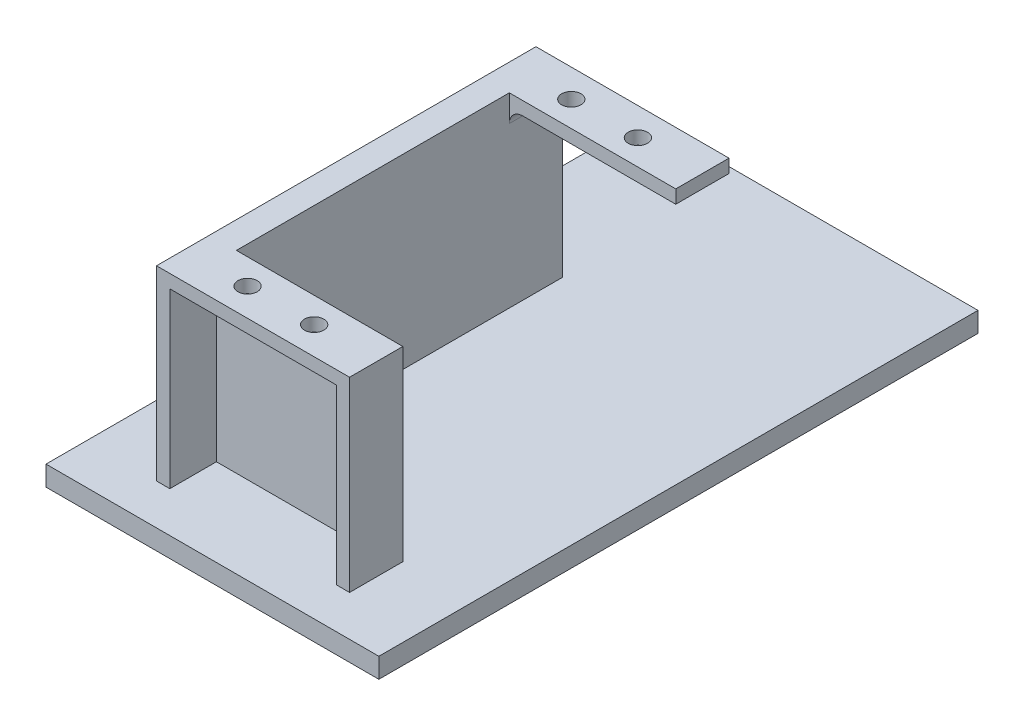
ISO-10303-21;
HEADER;
FILE_DESCRIPTION(('STEP AP214'),'2;1');
FILE_NAME('part.step','',(''),(''),'','','');
FILE_SCHEMA(('AUTOMOTIVE_DESIGN { 1 0 10303 214 1 1 1 1 }'));
ENDSEC;
DATA;
#1=APPLICATION_CONTEXT('core data for automotive mechanical design processes');
#2=APPLICATION_PROTOCOL_DEFINITION('international standard','automotive_design',2000,#1);
#3=PRODUCT_CONTEXT('',#1,'mechanical');
#4=PRODUCT('Part','Part','',(#3));
#5=PRODUCT_RELATED_PRODUCT_CATEGORY('part','',(#4));
#6=PRODUCT_DEFINITION_FORMATION('','',#4);
#7=PRODUCT_DEFINITION_CONTEXT('part definition',#1,'design');
#8=PRODUCT_DEFINITION('design','',#6,#7);
#9=PRODUCT_DEFINITION_SHAPE('','',#8);
#10=(LENGTH_UNIT() NAMED_UNIT(*) SI_UNIT(.MILLI.,.METRE.));
#11=(NAMED_UNIT(*) PLANE_ANGLE_UNIT() SI_UNIT($,.RADIAN.));
#12=(NAMED_UNIT(*) SI_UNIT($,.STERADIAN.) SOLID_ANGLE_UNIT());
#13=UNCERTAINTY_MEASURE_WITH_UNIT(LENGTH_MEASURE(1.E-05),#10,'distance_accuracy_value','');
#14=(GEOMETRIC_REPRESENTATION_CONTEXT(3) GLOBAL_UNCERTAINTY_ASSIGNED_CONTEXT((#13)) GLOBAL_UNIT_ASSIGNED_CONTEXT((#10,
#11,#12)) REPRESENTATION_CONTEXT('',''));
#15=CARTESIAN_POINT('',(0.,0.,0.));
#16=DIRECTION('',(0.,0.,1.));
#17=DIRECTION('',(1.,0.,0.));
#18=AXIS2_PLACEMENT_3D('',#15,#16,#17);
#19=CARTESIAN_POINT('',(14.5,28.,-28.5));
#20=DIRECTION('',(-1.,0.,0.));
#21=DIRECTION('',(0.,0.,1.));
#22=AXIS2_PLACEMENT_3D('',#19,#20,#21);
#23=PLANE('',#22);
#24=DIRECTION('',(0.,0.,-1.));
#25=VECTOR('',#24,1.);
#26=CARTESIAN_POINT('',(14.5,28.,-28.5));
#27=LINE('',#26,#25);
#28=CARTESIAN_POINT('',(14.5,28.,-20.5));
#29=VERTEX_POINT('',#28);
#30=CARTESIAN_POINT('',(14.5,28.,-28.5));
#31=VERTEX_POINT('',#30);
#32=EDGE_CURVE('E272',#29,#31,#27,.T.);
#33=ORIENTED_EDGE('',*,*,#32,.F.);
#34=DIRECTION('',(0.,1.,0.));
#35=VECTOR('',#34,1.);
#36=CARTESIAN_POINT('',(14.5,3.,-20.5));
#37=LINE('',#36,#35);
#38=CARTESIAN_POINT('',(14.5,26.,-20.5));
#39=VERTEX_POINT('',#38);
#40=EDGE_CURVE('E181',#39,#29,#37,.T.);
#41=ORIENTED_EDGE('',*,*,#40,.F.);
#42=DIRECTION('',(0.,0.,1.));
#43=VECTOR('',#42,1.);
#44=CARTESIAN_POINT('',(14.5,26.,-28.5));
#45=LINE('',#44,#43);
#46=CARTESIAN_POINT('',(14.5,26.,-28.5));
#47=VERTEX_POINT('',#46);
#48=EDGE_CURVE('E184',#47,#39,#45,.T.);
#49=ORIENTED_EDGE('',*,*,#48,.F.);
#50=DIRECTION('',(0.,-1.,0.));
#51=VECTOR('',#50,1.);
#52=CARTESIAN_POINT('',(14.5,28.,-28.5));
#53=LINE('',#52,#51);
#54=EDGE_CURVE('E297',#31,#47,#53,.T.);
#55=ORIENTED_EDGE('',*,*,#54,.F.);
#56=EDGE_LOOP('',(#33,#41,#49,#55));
#57=FACE_BOUND('',#56,.T.);
#58=ADVANCED_FACE('F33',(#57),#23,.F.);
#59=CARTESIAN_POINT('',(-14.5,28.,28.5));
#60=DIRECTION('',(0.,0.,-1.));
#61=DIRECTION('',(-1.,0.,0.));
#62=AXIS2_PLACEMENT_3D('',#59,#60,#61);
#63=PLANE('',#62);
#64=DIRECTION('',(0.,-1.,0.));
#65=VECTOR('',#64,1.);
#66=CARTESIAN_POINT('',(12.5,26.,28.5));
#67=LINE('',#66,#65);
#68=CARTESIAN_POINT('',(12.5,26.,28.5));
#69=VERTEX_POINT('',#68);
#70=CARTESIAN_POINT('',(12.5,0.,28.5));
#71=VERTEX_POINT('',#70);
#72=EDGE_CURVE('E205',#69,#71,#67,.T.);
#73=ORIENTED_EDGE('',*,*,#72,.T.);
#74=DIRECTION('',(1.,0.,0.));
#75=VECTOR('',#74,1.);
#76=CARTESIAN_POINT('',(-14.5,0.,28.5));
#77=LINE('',#76,#75);
#78=CARTESIAN_POINT('',(14.5,0.,28.5));
#79=VERTEX_POINT('',#78);
#80=EDGE_CURVE('E285',#71,#79,#77,.T.);
#81=ORIENTED_EDGE('',*,*,#80,.T.);
#82=DIRECTION('',(0.,-1.,0.));
#83=VECTOR('',#82,1.);
#84=CARTESIAN_POINT('',(14.5,28.,28.5));
#85=LINE('',#84,#83);
#86=CARTESIAN_POINT('',(14.5,28.,28.5));
#87=VERTEX_POINT('',#86);
#88=EDGE_CURVE('E278',#87,#79,#85,.T.);
#89=ORIENTED_EDGE('',*,*,#88,.F.);
#90=DIRECTION('',(1.,0.,0.));
#91=VECTOR('',#90,1.);
#92=CARTESIAN_POINT('',(-14.5,28.,28.5));
#93=LINE('',#92,#91);
#94=CARTESIAN_POINT('',(-14.5,28.,28.5));
#95=VERTEX_POINT('',#94);
#96=EDGE_CURVE('E276',#95,#87,#93,.T.);
#97=ORIENTED_EDGE('',*,*,#96,.F.);
#98=DIRECTION('',(0.,-1.,0.));
#99=VECTOR('',#98,1.);
#100=CARTESIAN_POINT('',(-14.5,28.,28.5));
#101=LINE('',#100,#99);
#102=CARTESIAN_POINT('',(-14.5,0.,28.5));
#103=VERTEX_POINT('',#102);
#104=EDGE_CURVE('E291',#95,#103,#101,.T.);
#105=ORIENTED_EDGE('',*,*,#104,.T.);
#106=CARTESIAN_POINT('',(-12.5,0.,28.5));
#107=VERTEX_POINT('',#106);
#108=EDGE_CURVE('E286',#103,#107,#77,.T.);
#109=ORIENTED_EDGE('',*,*,#108,.T.);
#110=DIRECTION('',(0.,1.,0.));
#111=VECTOR('',#110,1.);
#112=CARTESIAN_POINT('',(-12.5,26.,28.5));
#113=LINE('',#112,#111);
#114=CARTESIAN_POINT('',(-12.5,26.,28.5));
#115=VERTEX_POINT('',#114);
#116=EDGE_CURVE('E220',#107,#115,#113,.T.);
#117=ORIENTED_EDGE('',*,*,#116,.T.);
#118=DIRECTION('',(1.,0.,0.));
#119=VECTOR('',#118,1.);
#120=CARTESIAN_POINT('',(12.5,26.,28.5));
#121=LINE('',#120,#119);
#122=EDGE_CURVE('E210',#115,#69,#121,.T.);
#123=ORIENTED_EDGE('',*,*,#122,.T.);
#124=EDGE_LOOP('',(#73,#81,#89,#97,#105,#109,#117,#123));
#125=FACE_BOUND('',#124,.T.);
#126=ADVANCED_FACE('F350',(#125),#63,.F.);
#127=CARTESIAN_POINT('',(-5.,28.,24.32));
#128=DIRECTION('',(0.,-1.,0.));
#129=DIRECTION('',(0.,0.,-1.));
#130=AXIS2_PLACEMENT_3D('',#127,#128,#129);
#131=CYLINDRICAL_SURFACE('',#130,1.45);
#132=CARTESIAN_POINT('',(-5.,28.,24.32));
#133=DIRECTION('',(0.,1.,0.));
#134=DIRECTION('',(0.,0.,1.));
#135=AXIS2_PLACEMENT_3D('',#132,#133,#134);
#136=CIRCLE('',#135,1.45);
#137=CARTESIAN_POINT('',(-5.,28.,25.77));
#138=VERTEX_POINT('',#137);
#139=EDGE_CURVE('E244',#138,#138,#136,.T.);
#140=ORIENTED_EDGE('',*,*,#139,.T.);
#141=EDGE_LOOP('',(#140));
#142=FACE_BOUND('',#141,.T.);
#143=CARTESIAN_POINT('',(-5.,26.,24.32));
#144=DIRECTION('',(0.,-1.,0.));
#145=DIRECTION('',(0.,0.,-1.));
#146=AXIS2_PLACEMENT_3D('',#143,#144,#145);
#147=CIRCLE('',#146,1.45);
#148=CARTESIAN_POINT('',(-5.,26.,22.87));
#149=VERTEX_POINT('',#148);
#150=EDGE_CURVE('E235',#149,#149,#147,.T.);
#151=ORIENTED_EDGE('',*,*,#150,.T.);
#152=EDGE_LOOP('',(#151));
#153=FACE_BOUND('',#152,.T.);
#154=ADVANCED_FACE('F383',(#142,#153),#131,.F.);
#155=CARTESIAN_POINT('',(4.99999999999999,28.,24.32));
#156=DIRECTION('',(0.,-1.,0.));
#157=DIRECTION('',(0.,0.,-1.));
#158=AXIS2_PLACEMENT_3D('',#155,#156,#157);
#159=CYLINDRICAL_SURFACE('',#158,1.45);
#160=CARTESIAN_POINT('',(4.99999999999999,28.,24.32));
#161=DIRECTION('',(0.,1.,0.));
#162=DIRECTION('',(0.,0.,-1.));
#163=AXIS2_PLACEMENT_3D('',#160,#161,#162);
#164=CIRCLE('',#163,1.45);
#165=CARTESIAN_POINT('',(4.99999999999999,28.,22.87));
#166=VERTEX_POINT('',#165);
#167=EDGE_CURVE('E241',#166,#166,#164,.T.);
#168=ORIENTED_EDGE('',*,*,#167,.T.);
#169=EDGE_LOOP('',(#168));
#170=FACE_BOUND('',#169,.T.);
#171=CARTESIAN_POINT('',(4.99999999999999,26.,24.32));
#172=DIRECTION('',(0.,-1.,0.));
#173=DIRECTION('',(0.,0.,-1.));
#174=AXIS2_PLACEMENT_3D('',#171,#172,#173);
#175=CIRCLE('',#174,1.45);
#176=CARTESIAN_POINT('',(4.99999999999999,26.,22.87));
#177=VERTEX_POINT('',#176);
#178=EDGE_CURVE('E234',#177,#177,#175,.T.);
#179=ORIENTED_EDGE('',*,*,#178,.T.);
#180=EDGE_LOOP('',(#179));
#181=FACE_BOUND('',#180,.T.);
#182=ADVANCED_FACE('F391',(#170,#181),#159,.F.);
#183=CARTESIAN_POINT('',(0.,28.,0.));
#184=DIRECTION('',(0.,1.,0.));
#185=DIRECTION('',(0.,0.,1.));
#186=AXIS2_PLACEMENT_3D('',#183,#184,#185);
#187=PLANE('',#186);
#188=DIRECTION('',(-1.,0.,0.));
#189=VECTOR('',#188,1.);
#190=CARTESIAN_POINT('',(-10.5,28.,-20.5));
#191=LINE('',#190,#189);
#192=CARTESIAN_POINT('',(-10.5,28.,-20.5));
#193=VERTEX_POINT('',#192);
#194=EDGE_CURVE('E251',#29,#193,#191,.T.);
#195=ORIENTED_EDGE('',*,*,#194,.F.);
#196=ORIENTED_EDGE('',*,*,#32,.T.);
#197=DIRECTION('',(-1.,0.,0.));
#198=VECTOR('',#197,1.);
#199=CARTESIAN_POINT('',(-14.5,28.,-28.5));
#200=LINE('',#199,#198);
#201=CARTESIAN_POINT('',(-14.5,28.,-28.5));
#202=VERTEX_POINT('',#201);
#203=EDGE_CURVE('E271',#31,#202,#200,.T.);
#204=ORIENTED_EDGE('',*,*,#203,.T.);
#205=DIRECTION('',(0.,0.,1.));
#206=VECTOR('',#205,1.);
#207=CARTESIAN_POINT('',(-14.5,28.,-28.5));
#208=LINE('',#207,#206);
#209=EDGE_CURVE('E274',#202,#95,#208,.T.);
#210=ORIENTED_EDGE('',*,*,#209,.T.);
#211=ORIENTED_EDGE('',*,*,#96,.T.);
#212=CARTESIAN_POINT('',(14.5,28.,20.5));
#213=VERTEX_POINT('',#212);
#214=EDGE_CURVE('E268',#87,#213,#27,.T.);
#215=ORIENTED_EDGE('',*,*,#214,.T.);
#216=DIRECTION('',(1.,0.,0.));
#217=VECTOR('',#216,1.);
#218=CARTESIAN_POINT('',(-10.5,28.,20.5));
#219=LINE('',#218,#217);
#220=CARTESIAN_POINT('',(-10.5,28.,20.5));
#221=VERTEX_POINT('',#220);
#222=EDGE_CURVE('E257',#221,#213,#219,.T.);
#223=ORIENTED_EDGE('',*,*,#222,.F.);
#224=DIRECTION('',(0.,0.,1.));
#225=VECTOR('',#224,1.);
#226=CARTESIAN_POINT('',(-10.5,28.,20.5));
#227=LINE('',#226,#225);
#228=EDGE_CURVE('E253',#193,#221,#227,.T.);
#229=ORIENTED_EDGE('',*,*,#228,.F.);
#230=EDGE_LOOP('',(#195,#196,#204,#210,#211,#215,#223,#229));
#231=FACE_BOUND('',#230,.T.);
#232=ORIENTED_EDGE('',*,*,#167,.F.);
#233=EDGE_LOOP('',(#232));
#234=FACE_BOUND('',#233,.T.);
#235=CARTESIAN_POINT('',(-5.,28.,-24.31));
#236=DIRECTION('',(0.,1.,0.));
#237=DIRECTION('',(0.,0.,1.));
#238=AXIS2_PLACEMENT_3D('',#235,#236,#237);
#239=CIRCLE('',#238,1.45);
#240=CARTESIAN_POINT('',(-5.,28.,-22.86));
#241=VERTEX_POINT('',#240);
#242=EDGE_CURVE('E247',#241,#241,#239,.T.);
#243=ORIENTED_EDGE('',*,*,#242,.F.);
#244=EDGE_LOOP('',(#243));
#245=FACE_BOUND('',#244,.T.);
#246=ORIENTED_EDGE('',*,*,#139,.F.);
#247=EDGE_LOOP('',(#246));
#248=FACE_BOUND('',#247,.T.);
#249=CARTESIAN_POINT('',(5.,28.,-24.31));
#250=DIRECTION('',(0.,1.,0.));
#251=DIRECTION('',(0.,0.,-1.));
#252=AXIS2_PLACEMENT_3D('',#249,#250,#251);
#253=CIRCLE('',#252,1.45);
#254=CARTESIAN_POINT('',(5.,28.,-25.76));
#255=VERTEX_POINT('',#254);
#256=EDGE_CURVE('E238',#255,#255,#253,.T.);
#257=ORIENTED_EDGE('',*,*,#256,.F.);
#258=EDGE_LOOP('',(#257));
#259=FACE_BOUND('',#258,.T.);
#260=ADVANCED_FACE('F328',(#231,#234,#245,#248,#259),#187,.T.);
#261=DIRECTION('',(0.,-1.,0.));
#262=VECTOR('',#261,1.);
#263=CARTESIAN_POINT('',(14.5,26.,20.5));
#264=LINE('',#263,#262);
#265=CARTESIAN_POINT('',(14.5,0.,20.5));
#266=VERTEX_POINT('',#265);
#267=EDGE_CURVE('E194',#213,#266,#264,.T.);
#268=ORIENTED_EDGE('',*,*,#267,.F.);
#269=ORIENTED_EDGE('',*,*,#214,.F.);
#270=ORIENTED_EDGE('',*,*,#88,.T.);
#271=DIRECTION('',(0.,0.,-1.));
#272=VECTOR('',#271,1.);
#273=CARTESIAN_POINT('',(14.5,0.,-28.5));
#274=LINE('',#273,#272);
#275=EDGE_CURVE('E267',#79,#266,#274,.T.);
#276=ORIENTED_EDGE('',*,*,#275,.T.);
#277=EDGE_LOOP('',(#268,#269,#270,#276));
#278=FACE_BOUND('',#277,.T.);
#279=ADVANCED_FACE('F353',(#278),#23,.F.);
#280=CARTESIAN_POINT('',(-14.5,28.,-28.5));
#281=DIRECTION('',(0.,0.,1.));
#282=DIRECTION('',(1.,0.,0.));
#283=AXIS2_PLACEMENT_3D('',#280,#281,#282);
#284=PLANE('',#283);
#285=ORIENTED_EDGE('',*,*,#54,.T.);
#286=DIRECTION('',(1.,0.,0.));
#287=VECTOR('',#286,1.);
#288=CARTESIAN_POINT('',(-10.5,26.,-28.5));
#289=LINE('',#288,#287);
#290=CARTESIAN_POINT('',(-8.5,26.,-28.5));
#291=VERTEX_POINT('',#290);
#292=EDGE_CURVE('E193',#291,#47,#289,.T.);
#293=ORIENTED_EDGE('',*,*,#292,.F.);
#294=CARTESIAN_POINT('',(-8.5,24.,-28.5));
#295=DIRECTION('',(0.,0.,1.));
#296=DIRECTION('',(1.,0.,0.));
#297=AXIS2_PLACEMENT_3D('',#294,#295,#296);
#298=CIRCLE('',#297,2.);
#299=CARTESIAN_POINT('',(-10.5,24.,-28.5));
#300=VERTEX_POINT('',#299);
#301=EDGE_CURVE('E11',#291,#300,#298,.T.);
#302=ORIENTED_EDGE('',*,*,#301,.T.);
#303=DIRECTION('',(0.,1.,0.));
#304=VECTOR('',#303,1.);
#305=CARTESIAN_POINT('',(-10.5,26.,-28.5));
#306=LINE('',#305,#304);
#307=CARTESIAN_POINT('',(-10.5,0.,-28.5));
#308=VERTEX_POINT('',#307);
#309=EDGE_CURVE('E190',#308,#300,#306,.T.);
#310=ORIENTED_EDGE('',*,*,#309,.F.);
#311=DIRECTION('',(-1.,0.,0.));
#312=VECTOR('',#311,1.);
#313=CARTESIAN_POINT('',(-14.5,0.,-28.5));
#314=LINE('',#313,#312);
#315=CARTESIAN_POINT('',(-14.5,0.,-28.5));
#316=VERTEX_POINT('',#315);
#317=EDGE_CURVE('E281',#308,#316,#314,.T.);
#318=ORIENTED_EDGE('',*,*,#317,.T.);
#319=DIRECTION('',(0.,-1.,0.));
#320=VECTOR('',#319,1.);
#321=CARTESIAN_POINT('',(-14.5,28.,-28.5));
#322=LINE('',#321,#320);
#323=EDGE_CURVE('E294',#202,#316,#322,.T.);
#324=ORIENTED_EDGE('',*,*,#323,.F.);
#325=ORIENTED_EDGE('',*,*,#203,.F.);
#326=EDGE_LOOP('',(#285,#293,#302,#310,#318,#324,#325));
#327=FACE_BOUND('',#326,.T.);
#328=ADVANCED_FACE('F316',(#327),#284,.F.);
#329=CARTESIAN_POINT('',(-14.5,28.,-28.5));
#330=DIRECTION('',(1.,0.,0.));
#331=DIRECTION('',(0.,0.,-1.));
#332=AXIS2_PLACEMENT_3D('',#329,#330,#331);
#333=PLANE('',#332);
#334=DIRECTION('',(0.,0.,1.));
#335=VECTOR('',#334,1.);
#336=CARTESIAN_POINT('',(-14.5,0.,-28.5));
#337=LINE('',#336,#335);
#338=EDGE_CURVE('E283',#316,#103,#337,.T.);
#339=ORIENTED_EDGE('',*,*,#338,.T.);
#340=ORIENTED_EDGE('',*,*,#104,.F.);
#341=ORIENTED_EDGE('',*,*,#209,.F.);
#342=ORIENTED_EDGE('',*,*,#323,.T.);
#343=EDGE_LOOP('',(#339,#340,#341,#342));
#344=FACE_BOUND('',#343,.T.);
#345=ADVANCED_FACE('F344',(#344),#333,.F.);
#346=CARTESIAN_POINT('',(-10.5,28.,-20.5));
#347=DIRECTION('',(0.,0.,1.));
#348=DIRECTION('',(1.,0.,0.));
#349=AXIS2_PLACEMENT_3D('',#346,#347,#348);
#350=PLANE('',#349);
#351=DIRECTION('',(-1.,0.,0.));
#352=VECTOR('',#351,1.);
#353=CARTESIAN_POINT('',(-10.5,26.,-20.5));
#354=LINE('',#353,#352);
#355=CARTESIAN_POINT('',(-8.5,26.,-20.5));
#356=VERTEX_POINT('',#355);
#357=EDGE_CURVE('E203',#39,#356,#354,.T.);
#358=ORIENTED_EDGE('',*,*,#357,.F.);
#359=ORIENTED_EDGE('',*,*,#40,.T.);
#360=ORIENTED_EDGE('',*,*,#194,.T.);
#361=DIRECTION('',(0.,-1.,0.));
#362=VECTOR('',#361,1.);
#363=CARTESIAN_POINT('',(-10.5,28.,-20.5));
#364=LINE('',#363,#362);
#365=CARTESIAN_POINT('',(-10.5,24.,-20.5));
#366=VERTEX_POINT('',#365);
#367=EDGE_CURVE('E265',#193,#366,#364,.T.);
#368=ORIENTED_EDGE('',*,*,#367,.T.);
#369=CARTESIAN_POINT('',(-8.5,24.,-20.5));
#370=DIRECTION('',(0.,0.,1.));
#371=DIRECTION('',(1.,0.,0.));
#372=AXIS2_PLACEMENT_3D('',#369,#370,#371);
#373=CIRCLE('',#372,2.);
#374=EDGE_CURVE('E41',#366,#356,#373,.F.);
#375=ORIENTED_EDGE('',*,*,#374,.T.);
#376=EDGE_LOOP('',(#358,#359,#360,#368,#375));
#377=FACE_BOUND('',#376,.T.);
#378=ADVANCED_FACE('F326',(#377),#350,.T.);
#379=CARTESIAN_POINT('',(-10.5,28.,20.5));
#380=DIRECTION('',(1.,0.,0.));
#381=DIRECTION('',(0.,0.,-1.));
#382=AXIS2_PLACEMENT_3D('',#379,#380,#381);
#383=PLANE('',#382);
#384=ORIENTED_EDGE('',*,*,#309,.T.);
#385=DIRECTION('',(0.,0.,1.));
#386=VECTOR('',#385,1.);
#387=CARTESIAN_POINT('',(-10.5,24.,20.5));
#388=LINE('',#387,#386);
#389=EDGE_CURVE('E300',#300,#366,#388,.T.);
#390=ORIENTED_EDGE('',*,*,#389,.T.);
#391=ORIENTED_EDGE('',*,*,#367,.F.);
#392=ORIENTED_EDGE('',*,*,#228,.T.);
#393=DIRECTION('',(0.,-1.,0.));
#394=VECTOR('',#393,1.);
#395=CARTESIAN_POINT('',(-10.5,28.,20.5));
#396=LINE('',#395,#394);
#397=CARTESIAN_POINT('',(-10.5,0.,20.5));
#398=VERTEX_POINT('',#397);
#399=EDGE_CURVE('E259',#221,#398,#396,.T.);
#400=ORIENTED_EDGE('',*,*,#399,.T.);
#401=DIRECTION('',(0.,0.,1.));
#402=VECTOR('',#401,1.);
#403=CARTESIAN_POINT('',(-10.5,0.,20.5));
#404=LINE('',#403,#402);
#405=EDGE_CURVE('E250',#308,#398,#404,.T.);
#406=ORIENTED_EDGE('',*,*,#405,.F.);
#407=EDGE_LOOP('',(#384,#390,#391,#392,#400,#406));
#408=FACE_BOUND('',#407,.T.);
#409=ADVANCED_FACE('F310',(#408),#383,.T.);
#410=CARTESIAN_POINT('',(-10.5,28.,20.5));
#411=DIRECTION('',(0.,0.,-1.));
#412=DIRECTION('',(-1.,0.,0.));
#413=AXIS2_PLACEMENT_3D('',#410,#411,#412);
#414=PLANE('',#413);
#415=ORIENTED_EDGE('',*,*,#222,.T.);
#416=ORIENTED_EDGE('',*,*,#267,.T.);
#417=DIRECTION('',(1.,0.,0.));
#418=VECTOR('',#417,1.);
#419=CARTESIAN_POINT('',(-10.5,0.,20.5));
#420=LINE('',#419,#418);
#421=EDGE_CURVE('E254',#398,#266,#420,.T.);
#422=ORIENTED_EDGE('',*,*,#421,.F.);
#423=ORIENTED_EDGE('',*,*,#399,.F.);
#424=EDGE_LOOP('',(#415,#416,#422,#423));
#425=FACE_BOUND('',#424,.T.);
#426=ADVANCED_FACE('F333',(#425),#414,.T.);
#427=CARTESIAN_POINT('',(-5.,28.,-24.31));
#428=DIRECTION('',(0.,-1.,0.));
#429=DIRECTION('',(0.,0.,-1.));
#430=AXIS2_PLACEMENT_3D('',#427,#428,#429);
#431=CYLINDRICAL_SURFACE('',#430,1.45);
#432=CARTESIAN_POINT('',(-5.,26.,-24.31));
#433=DIRECTION('',(0.,1.,0.));
#434=DIRECTION('',(0.,0.,1.));
#435=AXIS2_PLACEMENT_3D('',#432,#433,#434);
#436=CIRCLE('',#435,1.45);
#437=CARTESIAN_POINT('',(-5.,26.,-22.86));
#438=VERTEX_POINT('',#437);
#439=EDGE_CURVE('E200',#438,#438,#436,.T.);
#440=ORIENTED_EDGE('',*,*,#439,.F.);
#441=EDGE_LOOP('',(#440));
#442=FACE_BOUND('',#441,.T.);
#443=ORIENTED_EDGE('',*,*,#242,.T.);
#444=EDGE_LOOP('',(#443));
#445=FACE_BOUND('',#444,.T.);
#446=ADVANCED_FACE('F411',(#442,#445),#431,.F.);
#447=CARTESIAN_POINT('',(5.,28.,-24.31));
#448=DIRECTION('',(0.,-1.,0.));
#449=DIRECTION('',(0.,0.,-1.));
#450=AXIS2_PLACEMENT_3D('',#447,#448,#449);
#451=CYLINDRICAL_SURFACE('',#450,1.45);
#452=CARTESIAN_POINT('',(5.,26.,-24.31));
#453=DIRECTION('',(0.,1.,0.));
#454=DIRECTION('',(0.,0.,1.));
#455=AXIS2_PLACEMENT_3D('',#452,#453,#454);
#456=CIRCLE('',#455,1.45);
#457=CARTESIAN_POINT('',(5.,26.,-22.86));
#458=VERTEX_POINT('',#457);
#459=EDGE_CURVE('E199',#458,#458,#456,.T.);
#460=ORIENTED_EDGE('',*,*,#459,.F.);
#461=EDGE_LOOP('',(#460));
#462=FACE_BOUND('',#461,.T.);
#463=ORIENTED_EDGE('',*,*,#256,.T.);
#464=EDGE_LOOP('',(#463));
#465=FACE_BOUND('',#464,.T.);
#466=ADVANCED_FACE('F377',(#462,#465),#451,.F.);
#467=CARTESIAN_POINT('',(12.5,26.,21.5));
#468=DIRECTION('',(-1.,0.,0.));
#469=DIRECTION('',(0.,-1.,0.));
#470=AXIS2_PLACEMENT_3D('',#467,#468,#469);
#471=PLANE('',#470);
#472=ORIENTED_EDGE('',*,*,#72,.F.);
#473=DIRECTION('',(0.,0.,1.));
#474=VECTOR('',#473,1.);
#475=CARTESIAN_POINT('',(12.5,26.,21.5));
#476=LINE('',#475,#474);
#477=CARTESIAN_POINT('',(12.5,26.,21.5));
#478=VERTEX_POINT('',#477);
#479=EDGE_CURVE('E217',#478,#69,#476,.T.);
#480=ORIENTED_EDGE('',*,*,#479,.F.);
#481=DIRECTION('',(0.,-1.,0.));
#482=VECTOR('',#481,1.);
#483=CARTESIAN_POINT('',(12.5,26.,21.5));
#484=LINE('',#483,#482);
#485=CARTESIAN_POINT('',(12.5,0.,21.5));
#486=VERTEX_POINT('',#485);
#487=EDGE_CURVE('E206',#478,#486,#484,.T.);
#488=ORIENTED_EDGE('',*,*,#487,.T.);
#489=DIRECTION('',(0.,0.,1.));
#490=VECTOR('',#489,1.);
#491=CARTESIAN_POINT('',(12.5,0.,21.5));
#492=LINE('',#491,#490);
#493=EDGE_CURVE('E232',#486,#71,#492,.T.);
#494=ORIENTED_EDGE('',*,*,#493,.T.);
#495=EDGE_LOOP('',(#472,#480,#488,#494));
#496=FACE_BOUND('',#495,.T.);
#497=ADVANCED_FACE('F356',(#496),#471,.T.);
#498=CARTESIAN_POINT('',(-12.5,26.,21.5));
#499=DIRECTION('',(1.,0.,0.));
#500=DIRECTION('',(0.,1.,0.));
#501=AXIS2_PLACEMENT_3D('',#498,#499,#500);
#502=PLANE('',#501);
#503=ORIENTED_EDGE('',*,*,#116,.F.);
#504=DIRECTION('',(0.,0.,1.));
#505=VECTOR('',#504,1.);
#506=CARTESIAN_POINT('',(-12.5,0.,21.5));
#507=LINE('',#506,#505);
#508=CARTESIAN_POINT('',(-12.5,0.,21.5));
#509=VERTEX_POINT('',#508);
#510=EDGE_CURVE('E229',#509,#107,#507,.T.);
#511=ORIENTED_EDGE('',*,*,#510,.F.);
#512=DIRECTION('',(0.,1.,0.));
#513=VECTOR('',#512,1.);
#514=CARTESIAN_POINT('',(-12.5,26.,21.5));
#515=LINE('',#514,#513);
#516=CARTESIAN_POINT('',(-12.5,26.,21.5));
#517=VERTEX_POINT('',#516);
#518=EDGE_CURVE('E213',#509,#517,#515,.T.);
#519=ORIENTED_EDGE('',*,*,#518,.T.);
#520=DIRECTION('',(0.,0.,1.));
#521=VECTOR('',#520,1.);
#522=CARTESIAN_POINT('',(-12.5,26.,21.5));
#523=LINE('',#522,#521);
#524=EDGE_CURVE('E227',#517,#115,#523,.T.);
#525=ORIENTED_EDGE('',*,*,#524,.T.);
#526=EDGE_LOOP('',(#503,#511,#519,#525));
#527=FACE_BOUND('',#526,.T.);
#528=ADVANCED_FACE('F368',(#527),#502,.T.);
#529=CARTESIAN_POINT('',(12.5,26.,21.5));
#530=DIRECTION('',(0.,-1.,0.));
#531=DIRECTION('',(0.,0.,-1.));
#532=AXIS2_PLACEMENT_3D('',#529,#530,#531);
#533=PLANE('',#532);
#534=ORIENTED_EDGE('',*,*,#150,.F.);
#535=EDGE_LOOP('',(#534));
#536=FACE_BOUND('',#535,.T.);
#537=ORIENTED_EDGE('',*,*,#178,.F.);
#538=EDGE_LOOP('',(#537));
#539=FACE_BOUND('',#538,.T.);
#540=ORIENTED_EDGE('',*,*,#122,.F.);
#541=ORIENTED_EDGE('',*,*,#524,.F.);
#542=DIRECTION('',(1.,0.,0.));
#543=VECTOR('',#542,1.);
#544=CARTESIAN_POINT('',(12.5,26.,21.5));
#545=LINE('',#544,#543);
#546=EDGE_CURVE('E215',#517,#478,#545,.T.);
#547=ORIENTED_EDGE('',*,*,#546,.T.);
#548=ORIENTED_EDGE('',*,*,#479,.T.);
#549=EDGE_LOOP('',(#540,#541,#547,#548));
#550=FACE_BOUND('',#549,.T.);
#551=ADVANCED_FACE('F362',(#536,#539,#550),#533,.T.);
#552=CARTESIAN_POINT('',(0.,0.,21.5));
#553=DIRECTION('',(0.,0.,-1.));
#554=DIRECTION('',(-1.,0.,0.));
#555=AXIS2_PLACEMENT_3D('',#552,#553,#554);
#556=PLANE('',#555);
#557=ORIENTED_EDGE('',*,*,#487,.F.);
#558=ORIENTED_EDGE('',*,*,#546,.F.);
#559=ORIENTED_EDGE('',*,*,#518,.F.);
#560=DIRECTION('',(-1.,0.,0.));
#561=VECTOR('',#560,1.);
#562=CARTESIAN_POINT('',(12.5,0.,21.5));
#563=LINE('',#562,#561);
#564=EDGE_CURVE('E209',#486,#509,#563,.T.);
#565=ORIENTED_EDGE('',*,*,#564,.F.);
#566=EDGE_LOOP('',(#557,#558,#559,#565));
#567=FACE_BOUND('',#566,.T.);
#568=ADVANCED_FACE('F365',(#567),#556,.F.);
#569=CARTESIAN_POINT('',(-10.5,26.,-28.5));
#570=DIRECTION('',(0.,1.,0.));
#571=DIRECTION('',(0.,0.,1.));
#572=AXIS2_PLACEMENT_3D('',#569,#570,#571);
#573=PLANE('',#572);
#574=ORIENTED_EDGE('',*,*,#357,.T.);
#575=DIRECTION('',(0.,0.,1.));
#576=VECTOR('',#575,1.);
#577=CARTESIAN_POINT('',(-8.5,26.,-28.5));
#578=LINE('',#577,#576);
#579=EDGE_CURVE('E48',#356,#291,#578,.F.);
#580=ORIENTED_EDGE('',*,*,#579,.T.);
#581=ORIENTED_EDGE('',*,*,#292,.T.);
#582=ORIENTED_EDGE('',*,*,#48,.T.);
#583=EDGE_LOOP('',(#574,#580,#581,#582));
#584=FACE_BOUND('',#583,.T.);
#585=ORIENTED_EDGE('',*,*,#439,.T.);
#586=EDGE_LOOP('',(#585));
#587=FACE_BOUND('',#586,.T.);
#588=ORIENTED_EDGE('',*,*,#459,.T.);
#589=EDGE_LOOP('',(#588));
#590=FACE_BOUND('',#589,.T.);
#591=ADVANCED_FACE('F321',(#584,#587,#590),#573,.F.);
#592=CARTESIAN_POINT('',(-8.5,24.,20.5));
#593=DIRECTION('',(0.,0.,1.));
#594=DIRECTION('',(0.,-1.,0.));
#595=AXIS2_PLACEMENT_3D('',#592,#593,#594);
#596=CYLINDRICAL_SURFACE('',#595,2.);
#597=ORIENTED_EDGE('',*,*,#301,.F.);
#598=ORIENTED_EDGE('',*,*,#579,.F.);
#599=ORIENTED_EDGE('',*,*,#374,.F.);
#600=ORIENTED_EDGE('',*,*,#389,.F.);
#601=EDGE_LOOP('',(#597,#598,#599,#600));
#602=FACE_BOUND('',#601,.T.);
#603=ADVANCED_FACE('F35',(#602),#596,.F.);
#604=CARTESIAN_POINT('',(25.,-3.,34.6));
#605=DIRECTION('',(-1.,0.,0.));
#606=DIRECTION('',(0.,0.,1.));
#607=AXIS2_PLACEMENT_3D('',#604,#605,#606);
#608=PLANE('',#607);
#609=DIRECTION('',(0.,0.,1.));
#610=VECTOR('',#609,1.);
#611=CARTESIAN_POINT('',(25.,0.,34.6));
#612=LINE('',#611,#610);
#613=CARTESIAN_POINT('',(25.,0.,-55.4));
#614=VERTEX_POINT('',#613);
#615=CARTESIAN_POINT('',(25.,0.,34.6));
#616=VERTEX_POINT('',#615);
#617=EDGE_CURVE('E180',#614,#616,#612,.T.);
#618=ORIENTED_EDGE('',*,*,#617,.T.);
#619=DIRECTION('',(0.,1.,0.));
#620=VECTOR('',#619,1.);
#621=CARTESIAN_POINT('',(25.,-3.,34.6));
#622=LINE('',#621,#620);
#623=CARTESIAN_POINT('',(25.,-3.,34.6));
#624=VERTEX_POINT('',#623);
#625=EDGE_CURVE('E160',#624,#616,#622,.T.);
#626=ORIENTED_EDGE('',*,*,#625,.F.);
#627=DIRECTION('',(0.,0.,1.));
#628=VECTOR('',#627,1.);
#629=CARTESIAN_POINT('',(25.,-3.,34.6));
#630=LINE('',#629,#628);
#631=CARTESIAN_POINT('',(25.,-3.,-55.4));
#632=VERTEX_POINT('',#631);
#633=EDGE_CURVE('E167',#632,#624,#630,.T.);
#634=ORIENTED_EDGE('',*,*,#633,.F.);
#635=DIRECTION('',(0.,1.,0.));
#636=VECTOR('',#635,1.);
#637=CARTESIAN_POINT('',(25.,-3.,-55.4));
#638=LINE('',#637,#636);
#639=EDGE_CURVE('E598',#632,#614,#638,.T.);
#640=ORIENTED_EDGE('',*,*,#639,.T.);
#641=EDGE_LOOP('',(#618,#626,#634,#640));
#642=FACE_BOUND('',#641,.T.);
#643=ADVANCED_FACE('F178',(#642),#608,.F.);
#644=CARTESIAN_POINT('',(-25.,-3.,34.6));
#645=DIRECTION('',(0.,0.,-1.));
#646=DIRECTION('',(-1.,0.,0.));
#647=AXIS2_PLACEMENT_3D('',#644,#645,#646);
#648=PLANE('',#647);
#649=DIRECTION('',(-1.,0.,0.));
#650=VECTOR('',#649,1.);
#651=CARTESIAN_POINT('',(-25.,0.,34.6));
#652=LINE('',#651,#650);
#653=CARTESIAN_POINT('',(-25.,0.,34.6));
#654=VERTEX_POINT('',#653);
#655=EDGE_CURVE('E604',#616,#654,#652,.T.);
#656=ORIENTED_EDGE('',*,*,#655,.T.);
#657=DIRECTION('',(0.,1.,0.));
#658=VECTOR('',#657,1.);
#659=CARTESIAN_POINT('',(-25.,-3.,34.6));
#660=LINE('',#659,#658);
#661=CARTESIAN_POINT('',(-25.,-3.,34.6));
#662=VERTEX_POINT('',#661);
#663=EDGE_CURVE('E163',#662,#654,#660,.T.);
#664=ORIENTED_EDGE('',*,*,#663,.F.);
#665=DIRECTION('',(-1.,0.,0.));
#666=VECTOR('',#665,1.);
#667=CARTESIAN_POINT('',(-25.,-3.,34.6));
#668=LINE('',#667,#666);
#669=EDGE_CURVE('E156',#624,#662,#668,.T.);
#670=ORIENTED_EDGE('',*,*,#669,.F.);
#671=ORIENTED_EDGE('',*,*,#625,.T.);
#672=EDGE_LOOP('',(#656,#664,#670,#671));
#673=FACE_BOUND('',#672,.T.);
#674=ADVANCED_FACE('F158',(#673),#648,.F.);
#675=CARTESIAN_POINT('',(-25.,-3.,34.6));
#676=DIRECTION('',(1.,0.,0.));
#677=DIRECTION('',(0.,0.,-1.));
#678=AXIS2_PLACEMENT_3D('',#675,#676,#677);
#679=PLANE('',#678);
#680=DIRECTION('',(0.,0.,-1.));
#681=VECTOR('',#680,1.);
#682=CARTESIAN_POINT('',(-25.,0.,34.6));
#683=LINE('',#682,#681);
#684=CARTESIAN_POINT('',(-25.,0.,-55.4));
#685=VERTEX_POINT('',#684);
#686=EDGE_CURVE('E601',#654,#685,#683,.T.);
#687=ORIENTED_EDGE('',*,*,#686,.T.);
#688=DIRECTION('',(0.,1.,0.));
#689=VECTOR('',#688,1.);
#690=CARTESIAN_POINT('',(-25.,-3.,-55.4));
#691=LINE('',#690,#689);
#692=CARTESIAN_POINT('',(-25.,-3.,-55.4));
#693=VERTEX_POINT('',#692);
#694=EDGE_CURVE('E186',#693,#685,#691,.T.);
#695=ORIENTED_EDGE('',*,*,#694,.F.);
#696=DIRECTION('',(0.,0.,-1.));
#697=VECTOR('',#696,1.);
#698=CARTESIAN_POINT('',(-25.,-3.,34.6));
#699=LINE('',#698,#697);
#700=EDGE_CURVE('E166',#662,#693,#699,.T.);
#701=ORIENTED_EDGE('',*,*,#700,.F.);
#702=ORIENTED_EDGE('',*,*,#663,.T.);
#703=EDGE_LOOP('',(#687,#695,#701,#702));
#704=FACE_BOUND('',#703,.T.);
#705=ADVANCED_FACE('F441',(#704),#679,.F.);
#706=CARTESIAN_POINT('',(-25.,-3.,-55.4));
#707=DIRECTION('',(0.,0.,1.));
#708=DIRECTION('',(1.,0.,0.));
#709=AXIS2_PLACEMENT_3D('',#706,#707,#708);
#710=PLANE('',#709);
#711=DIRECTION('',(1.,0.,0.));
#712=VECTOR('',#711,1.);
#713=CARTESIAN_POINT('',(-25.,0.,-55.4));
#714=LINE('',#713,#712);
#715=EDGE_CURVE('E176',#685,#614,#714,.T.);
#716=ORIENTED_EDGE('',*,*,#715,.T.);
#717=ORIENTED_EDGE('',*,*,#639,.F.);
#718=DIRECTION('',(1.,0.,0.));
#719=VECTOR('',#718,1.);
#720=CARTESIAN_POINT('',(-25.,-3.,-55.4));
#721=LINE('',#720,#719);
#722=EDGE_CURVE('E172',#693,#632,#721,.T.);
#723=ORIENTED_EDGE('',*,*,#722,.F.);
#724=ORIENTED_EDGE('',*,*,#694,.T.);
#725=EDGE_LOOP('',(#716,#717,#723,#724));
#726=FACE_BOUND('',#725,.T.);
#727=ADVANCED_FACE('F444',(#726),#710,.F.);
#728=CARTESIAN_POINT('',(0.,-3.,0.));
#729=DIRECTION('',(0.,-1.,0.));
#730=DIRECTION('',(0.,0.,-1.));
#731=AXIS2_PLACEMENT_3D('',#728,#729,#730);
#732=PLANE('',#731);
#733=ORIENTED_EDGE('',*,*,#633,.T.);
#734=ORIENTED_EDGE('',*,*,#669,.T.);
#735=ORIENTED_EDGE('',*,*,#700,.T.);
#736=ORIENTED_EDGE('',*,*,#722,.T.);
#737=EDGE_LOOP('',(#733,#734,#735,#736));
#738=FACE_BOUND('',#737,.T.);
#739=ADVANCED_FACE('F170',(#738),#732,.T.);
#740=CARTESIAN_POINT('',(0.,0.,0.));
#741=DIRECTION('',(0.,-1.,0.));
#742=DIRECTION('',(0.,0.,-1.));
#743=AXIS2_PLACEMENT_3D('',#740,#741,#742);
#744=PLANE('',#743);
#745=ORIENTED_EDGE('',*,*,#405,.T.);
#746=ORIENTED_EDGE('',*,*,#421,.T.);
#747=ORIENTED_EDGE('',*,*,#275,.F.);
#748=ORIENTED_EDGE('',*,*,#80,.F.);
#749=ORIENTED_EDGE('',*,*,#493,.F.);
#750=ORIENTED_EDGE('',*,*,#564,.T.);
#751=ORIENTED_EDGE('',*,*,#510,.T.);
#752=ORIENTED_EDGE('',*,*,#108,.F.);
#753=ORIENTED_EDGE('',*,*,#338,.F.);
#754=ORIENTED_EDGE('',*,*,#317,.F.);
#755=EDGE_LOOP('',(#745,#746,#747,#748,#749,#750,#751,#752,#753,#754));
#756=FACE_BOUND('',#755,.T.);
#757=ORIENTED_EDGE('',*,*,#617,.F.);
#758=ORIENTED_EDGE('',*,*,#715,.F.);
#759=ORIENTED_EDGE('',*,*,#686,.F.);
#760=ORIENTED_EDGE('',*,*,#655,.F.);
#761=EDGE_LOOP('',(#757,#758,#759,#760));
#762=FACE_BOUND('',#761,.T.);
#763=ADVANCED_FACE('F337',(#756,#762),#744,.F.);
#764=CLOSED_SHELL('',(#58,#126,#154,#182,#260,#279,#328,#345,#378,#409,#426,#446,#466,#497,#528,
#551,#568,#591,#603,#643,#674,#705,#727,#739,#763));
#765=MANIFOLD_SOLID_BREP('B2',#764);
#766=ADVANCED_BREP_SHAPE_REPRESENTATION('',(#18,#765),#14);
#767=SHAPE_DEFINITION_REPRESENTATION(#9,#766);
ENDSEC;
END-ISO-10303-21;
